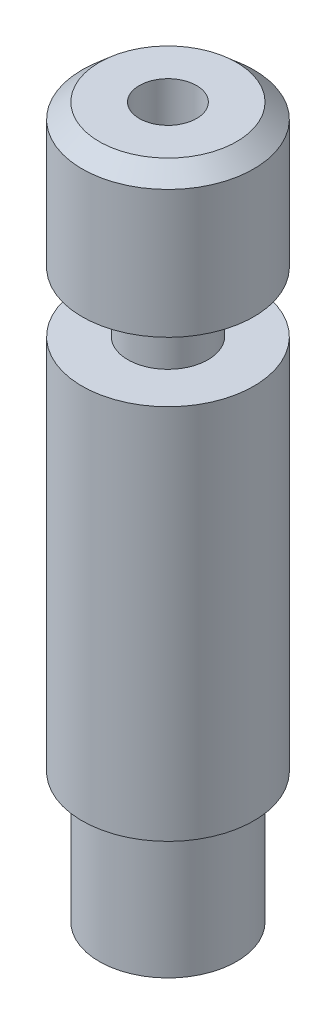
ISO-10303-21;
HEADER;
FILE_DESCRIPTION(('STEP AP214'),'2;1');
FILE_NAME('part.step','',(''),(''),'','','');
FILE_SCHEMA(('AUTOMOTIVE_DESIGN { 1 0 10303 214 1 1 1 1 }'));
ENDSEC;
DATA;
#1=APPLICATION_CONTEXT('core data for automotive mechanical design processes');
#2=APPLICATION_PROTOCOL_DEFINITION('international standard','automotive_design',2000,#1);
#3=PRODUCT_CONTEXT('',#1,'mechanical');
#4=PRODUCT('Part','Part','',(#3));
#5=PRODUCT_RELATED_PRODUCT_CATEGORY('part','',(#4));
#6=PRODUCT_DEFINITION_FORMATION('','',#4);
#7=PRODUCT_DEFINITION_CONTEXT('part definition',#1,'design');
#8=PRODUCT_DEFINITION('design','',#6,#7);
#9=PRODUCT_DEFINITION_SHAPE('','',#8);
#10=(LENGTH_UNIT() NAMED_UNIT(*) SI_UNIT(.MILLI.,.METRE.));
#11=(NAMED_UNIT(*) PLANE_ANGLE_UNIT() SI_UNIT($,.RADIAN.));
#12=(NAMED_UNIT(*) SI_UNIT($,.STERADIAN.) SOLID_ANGLE_UNIT());
#13=UNCERTAINTY_MEASURE_WITH_UNIT(LENGTH_MEASURE(1.E-05),#10,'distance_accuracy_value','');
#14=(GEOMETRIC_REPRESENTATION_CONTEXT(3) GLOBAL_UNCERTAINTY_ASSIGNED_CONTEXT((#13)) GLOBAL_UNIT_ASSIGNED_CONTEXT((#10,
#11,#12)) REPRESENTATION_CONTEXT('',''));
#15=CARTESIAN_POINT('',(0.,0.,0.));
#16=DIRECTION('',(0.,0.,1.));
#17=DIRECTION('',(1.,0.,0.));
#18=AXIS2_PLACEMENT_3D('',#15,#16,#17);
#19=CARTESIAN_POINT('',(0.,25.1,0.));
#20=DIRECTION('',(0.,1.,0.));
#21=DIRECTION('',(-1.,0.,0.));
#22=AXIS2_PLACEMENT_3D('',#19,#20,#21);
#23=CYLINDRICAL_SURFACE('',#22,1.);
#24=CARTESIAN_POINT('',(0.,0.,0.));
#25=DIRECTION('',(0.,1.,0.));
#26=DIRECTION('',(-1.,0.,0.));
#27=AXIS2_PLACEMENT_3D('',#24,#25,#26);
#28=CIRCLE('',#27,1.);
#29=CARTESIAN_POINT('',(-1.,0.,0.));
#30=VERTEX_POINT('',#29);
#31=EDGE_CURVE('E10',#30,#30,#28,.T.);
#32=ORIENTED_EDGE('',*,*,#31,.F.);
#33=EDGE_LOOP('',(#32));
#34=FACE_BOUND('',#33,.T.);
#35=CARTESIAN_POINT('',(0.,25.1,0.));
#36=DIRECTION('',(0.,1.,0.));
#37=DIRECTION('',(-1.,0.,0.));
#38=AXIS2_PLACEMENT_3D('',#35,#36,#37);
#39=CIRCLE('',#38,1.);
#40=CARTESIAN_POINT('',(-1.,25.1,0.));
#41=VERTEX_POINT('',#40);
#42=EDGE_CURVE('E54',#41,#41,#39,.T.);
#43=ORIENTED_EDGE('',*,*,#42,.T.);
#44=EDGE_LOOP('',(#43));
#45=FACE_BOUND('',#44,.T.);
#46=ADVANCED_FACE('F14',(#34,#45),#23,.F.);
#47=CARTESIAN_POINT('',(0.,0.,0.));
#48=DIRECTION('',(0.,1.,0.));
#49=DIRECTION('',(-1.,0.,0.));
#50=AXIS2_PLACEMENT_3D('',#47,#48,#49);
#51=PLANE('',#50);
#52=CARTESIAN_POINT('',(0.,0.,0.));
#53=DIRECTION('',(0.,1.,0.));
#54=DIRECTION('',(-1.,0.,0.));
#55=AXIS2_PLACEMENT_3D('',#52,#53,#54);
#56=CIRCLE('',#55,1.9);
#57=CARTESIAN_POINT('',(-1.9,0.,0.));
#58=VERTEX_POINT('',#57);
#59=EDGE_CURVE('E20',#58,#58,#56,.T.);
#60=ORIENTED_EDGE('',*,*,#59,.F.);
#61=EDGE_LOOP('',(#60));
#62=FACE_BOUND('',#61,.T.);
#63=ORIENTED_EDGE('',*,*,#31,.T.);
#64=EDGE_LOOP('',(#63));
#65=FACE_BOUND('',#64,.T.);
#66=ADVANCED_FACE('F73',(#62,#65),#51,.F.);
#67=CARTESIAN_POINT('',(0.,0.,0.));
#68=DIRECTION('',(0.,1.,0.));
#69=DIRECTION('',(-1.,0.,0.));
#70=AXIS2_PLACEMENT_3D('',#67,#68,#69);
#71=CONICAL_SURFACE('',#70,1.9,1.0471975511966);
#72=CARTESIAN_POINT('',(0.,0.288675134594817,0.));
#73=DIRECTION('',(0.,1.,0.));
#74=DIRECTION('',(-1.,0.,0.));
#75=AXIS2_PLACEMENT_3D('',#72,#73,#74);
#76=CIRCLE('',#75,2.4);
#77=CARTESIAN_POINT('',(-2.4,0.288675134594817,0.));
#78=VERTEX_POINT('',#77);
#79=EDGE_CURVE('E24',#78,#78,#76,.T.);
#80=ORIENTED_EDGE('',*,*,#79,.F.);
#81=EDGE_LOOP('',(#80));
#82=FACE_BOUND('',#81,.T.);
#83=ORIENTED_EDGE('',*,*,#59,.T.);
#84=EDGE_LOOP('',(#83));
#85=FACE_BOUND('',#84,.T.);
#86=ADVANCED_FACE('F79',(#82,#85),#71,.T.);
#87=CARTESIAN_POINT('',(0.,25.1,0.));
#88=DIRECTION('',(0.,1.,0.));
#89=DIRECTION('',(-1.,0.,0.));
#90=AXIS2_PLACEMENT_3D('',#87,#88,#89);
#91=CYLINDRICAL_SURFACE('',#90,2.4);
#92=CARTESIAN_POINT('',(0.,4.5,0.));
#93=DIRECTION('',(0.,1.,0.));
#94=DIRECTION('',(-1.,0.,0.));
#95=AXIS2_PLACEMENT_3D('',#92,#93,#94);
#96=CIRCLE('',#95,2.4);
#97=CARTESIAN_POINT('',(-2.4,4.5,0.));
#98=VERTEX_POINT('',#97);
#99=EDGE_CURVE('E28',#98,#98,#96,.T.);
#100=ORIENTED_EDGE('',*,*,#99,.F.);
#101=EDGE_LOOP('',(#100));
#102=FACE_BOUND('',#101,.T.);
#103=ORIENTED_EDGE('',*,*,#79,.T.);
#104=EDGE_LOOP('',(#103));
#105=FACE_BOUND('',#104,.T.);
#106=ADVANCED_FACE('F85',(#102,#105),#91,.T.);
#107=CARTESIAN_POINT('',(0.,4.5,0.));
#108=DIRECTION('',(0.,1.,0.));
#109=DIRECTION('',(-1.,0.,0.));
#110=AXIS2_PLACEMENT_3D('',#107,#108,#109);
#111=CONICAL_SURFACE('',#110,2.4,1.0471975511966);
#112=CARTESIAN_POINT('',(0.,4.84641016151378,0.));
#113=DIRECTION('',(0.,1.,0.));
#114=DIRECTION('',(-1.,0.,0.));
#115=AXIS2_PLACEMENT_3D('',#112,#113,#114);
#116=CIRCLE('',#115,3.);
#117=CARTESIAN_POINT('',(-3.,4.84641016151378,0.));
#118=VERTEX_POINT('',#117);
#119=EDGE_CURVE('E33',#118,#118,#116,.T.);
#120=ORIENTED_EDGE('',*,*,#119,.F.);
#121=EDGE_LOOP('',(#120));
#122=FACE_BOUND('',#121,.T.);
#123=ORIENTED_EDGE('',*,*,#99,.T.);
#124=EDGE_LOOP('',(#123));
#125=FACE_BOUND('',#124,.T.);
#126=ADVANCED_FACE('F91',(#122,#125),#111,.T.);
#127=CARTESIAN_POINT('',(0.,25.1,0.));
#128=DIRECTION('',(0.,1.,0.));
#129=DIRECTION('',(-1.,0.,0.));
#130=AXIS2_PLACEMENT_3D('',#127,#128,#129);
#131=CYLINDRICAL_SURFACE('',#130,3.);
#132=CARTESIAN_POINT('',(0.,18.,0.));
#133=DIRECTION('',(0.,1.,0.));
#134=DIRECTION('',(-1.,0.,0.));
#135=AXIS2_PLACEMENT_3D('',#132,#133,#134);
#136=CIRCLE('',#135,3.);
#137=CARTESIAN_POINT('',(-3.,18.,0.));
#138=VERTEX_POINT('',#137);
#139=EDGE_CURVE('E36',#138,#138,#136,.T.);
#140=ORIENTED_EDGE('',*,*,#139,.F.);
#141=EDGE_LOOP('',(#140));
#142=FACE_BOUND('',#141,.T.);
#143=ORIENTED_EDGE('',*,*,#119,.T.);
#144=EDGE_LOOP('',(#143));
#145=FACE_BOUND('',#144,.T.);
#146=ADVANCED_FACE('F95',(#142,#145),#131,.T.);
#147=CARTESIAN_POINT('',(0.,18.,0.));
#148=DIRECTION('',(0.,-1.,0.));
#149=DIRECTION('',(1.,0.,0.));
#150=AXIS2_PLACEMENT_3D('',#147,#148,#149);
#151=PLANE('',#150);
#152=CARTESIAN_POINT('',(0.,18.,0.));
#153=DIRECTION('',(0.,1.,0.));
#154=DIRECTION('',(-1.,0.,0.));
#155=AXIS2_PLACEMENT_3D('',#152,#153,#154);
#156=CIRCLE('',#155,1.4);
#157=CARTESIAN_POINT('',(-1.4,18.,0.));
#158=VERTEX_POINT('',#157);
#159=EDGE_CURVE('E39',#158,#158,#156,.T.);
#160=ORIENTED_EDGE('',*,*,#159,.F.);
#161=EDGE_LOOP('',(#160));
#162=FACE_BOUND('',#161,.T.);
#163=ORIENTED_EDGE('',*,*,#139,.T.);
#164=EDGE_LOOP('',(#163));
#165=FACE_BOUND('',#164,.T.);
#166=ADVANCED_FACE('F99',(#162,#165),#151,.F.);
#167=CARTESIAN_POINT('',(0.,25.1,0.));
#168=DIRECTION('',(0.,1.,0.));
#169=DIRECTION('',(-1.,0.,0.));
#170=AXIS2_PLACEMENT_3D('',#167,#168,#169);
#171=CYLINDRICAL_SURFACE('',#170,1.4);
#172=CARTESIAN_POINT('',(0.,20.1,0.));
#173=DIRECTION('',(0.,1.,0.));
#174=DIRECTION('',(-1.,0.,0.));
#175=AXIS2_PLACEMENT_3D('',#172,#173,#174);
#176=CIRCLE('',#175,1.4);
#177=CARTESIAN_POINT('',(-1.4,20.1,0.));
#178=VERTEX_POINT('',#177);
#179=EDGE_CURVE('E42',#178,#178,#176,.T.);
#180=ORIENTED_EDGE('',*,*,#179,.F.);
#181=EDGE_LOOP('',(#180));
#182=FACE_BOUND('',#181,.T.);
#183=ORIENTED_EDGE('',*,*,#159,.T.);
#184=EDGE_LOOP('',(#183));
#185=FACE_BOUND('',#184,.T.);
#186=ADVANCED_FACE('F103',(#182,#185),#171,.T.);
#187=CARTESIAN_POINT('',(0.,20.1,0.));
#188=DIRECTION('',(0.,1.,0.));
#189=DIRECTION('',(-1.,0.,0.));
#190=AXIS2_PLACEMENT_3D('',#187,#188,#189);
#191=PLANE('',#190);
#192=CARTESIAN_POINT('',(0.,20.1,0.));
#193=DIRECTION('',(0.,1.,0.));
#194=DIRECTION('',(-1.,0.,0.));
#195=AXIS2_PLACEMENT_3D('',#192,#193,#194);
#196=CIRCLE('',#195,3.);
#197=CARTESIAN_POINT('',(-3.,20.1,0.));
#198=VERTEX_POINT('',#197);
#199=EDGE_CURVE('E45',#198,#198,#196,.T.);
#200=ORIENTED_EDGE('',*,*,#199,.F.);
#201=EDGE_LOOP('',(#200));
#202=FACE_BOUND('',#201,.T.);
#203=ORIENTED_EDGE('',*,*,#179,.T.);
#204=EDGE_LOOP('',(#203));
#205=FACE_BOUND('',#204,.T.);
#206=ADVANCED_FACE('F107',(#202,#205),#191,.F.);
#207=CARTESIAN_POINT('',(0.,25.1,0.));
#208=DIRECTION('',(0.,1.,0.));
#209=DIRECTION('',(-1.,0.,0.));
#210=AXIS2_PLACEMENT_3D('',#207,#208,#209);
#211=CYLINDRICAL_SURFACE('',#210,3.);
#212=CARTESIAN_POINT('',(0.,24.5749144495438,0.));
#213=DIRECTION('',(0.,1.,0.));
#214=DIRECTION('',(-1.,0.,0.));
#215=AXIS2_PLACEMENT_3D('',#212,#213,#214);
#216=CIRCLE('',#215,3.);
#217=CARTESIAN_POINT('',(-3.,24.5749144495438,0.));
#218=VERTEX_POINT('',#217);
#219=EDGE_CURVE('E48',#218,#218,#216,.T.);
#220=ORIENTED_EDGE('',*,*,#219,.F.);
#221=EDGE_LOOP('',(#220));
#222=FACE_BOUND('',#221,.T.);
#223=ORIENTED_EDGE('',*,*,#199,.T.);
#224=EDGE_LOOP('',(#223));
#225=FACE_BOUND('',#224,.T.);
#226=ADVANCED_FACE('F69',(#222,#225),#211,.T.);
#227=CARTESIAN_POINT('',(0.,24.5749144495438,0.));
#228=DIRECTION('',(0.,-1.,0.));
#229=DIRECTION('',(1.,0.,0.));
#230=AXIS2_PLACEMENT_3D('',#227,#228,#229);
#231=CONICAL_SURFACE('',#230,3.,0.851885577286399);
#232=CARTESIAN_POINT('',(0.,25.1,0.));
#233=DIRECTION('',(0.,1.,0.));
#234=DIRECTION('',(-1.,0.,0.));
#235=AXIS2_PLACEMENT_3D('',#232,#233,#234);
#236=CIRCLE('',#235,2.4);
#237=CARTESIAN_POINT('',(-2.4,25.1,0.));
#238=VERTEX_POINT('',#237);
#239=EDGE_CURVE('E51',#238,#238,#236,.T.);
#240=ORIENTED_EDGE('',*,*,#239,.F.);
#241=EDGE_LOOP('',(#240));
#242=FACE_BOUND('',#241,.T.);
#243=ORIENTED_EDGE('',*,*,#219,.T.);
#244=EDGE_LOOP('',(#243));
#245=FACE_BOUND('',#244,.T.);
#246=ADVANCED_FACE('F61',(#242,#245),#231,.T.);
#247=CARTESIAN_POINT('',(0.,25.1,0.));
#248=DIRECTION('',(0.,1.,0.));
#249=DIRECTION('',(-1.,0.,0.));
#250=AXIS2_PLACEMENT_3D('',#247,#248,#249);
#251=PLANE('',#250);
#252=ORIENTED_EDGE('',*,*,#239,.T.);
#253=EDGE_LOOP('',(#252));
#254=FACE_BOUND('',#253,.T.);
#255=ORIENTED_EDGE('',*,*,#42,.F.);
#256=EDGE_LOOP('',(#255));
#257=FACE_BOUND('',#256,.T.);
#258=ADVANCED_FACE('F59',(#254,#257),#251,.T.);
#259=CLOSED_SHELL('',(#46,#66,#86,#106,#126,#146,#166,#186,#206,#226,#246,#258));
#260=MANIFOLD_SOLID_BREP('B1',#259);
#261=ADVANCED_BREP_SHAPE_REPRESENTATION('',(#18,#260),#14);
#262=SHAPE_DEFINITION_REPRESENTATION(#9,#261);
ENDSEC;
END-ISO-10303-21;
